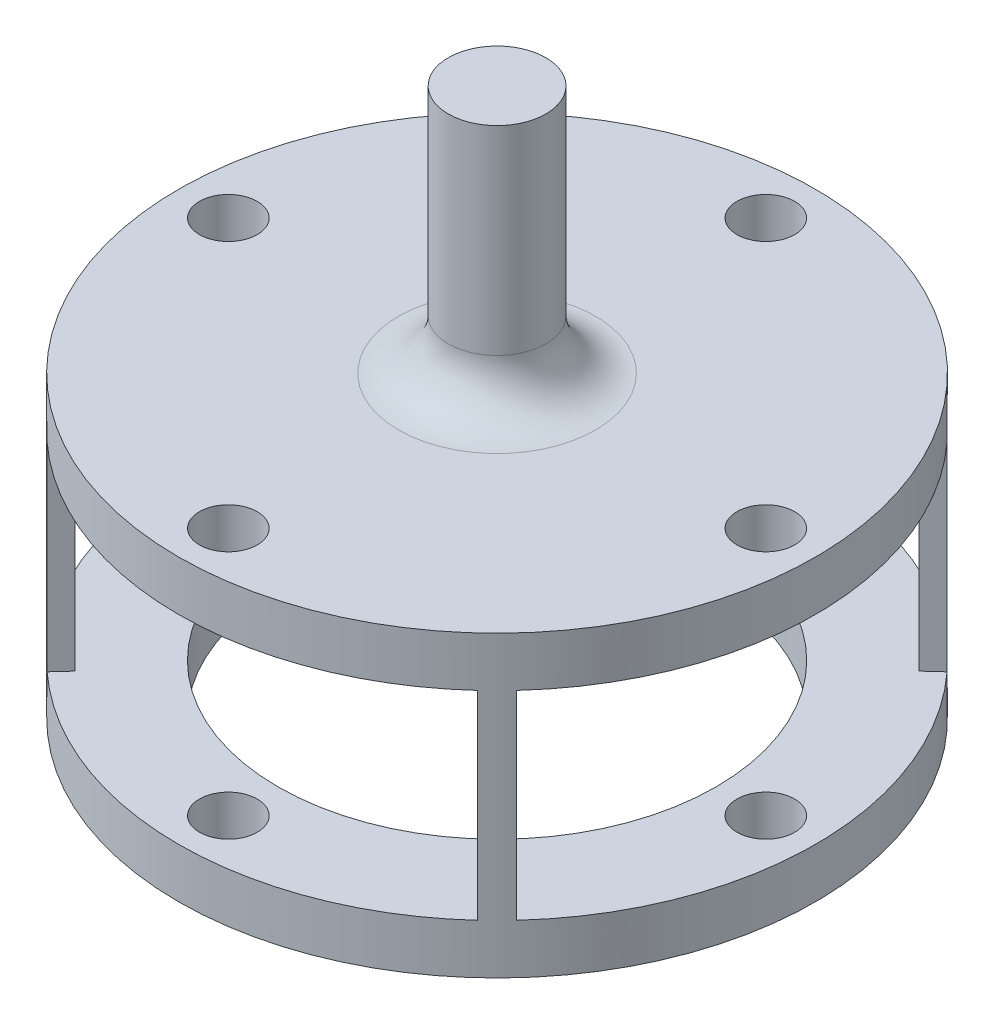
ISO-10303-21;
HEADER;
FILE_DESCRIPTION(('STEP AP214'),'2;1');
FILE_NAME('part.step','',(''),(''),'','','');
FILE_SCHEMA(('AUTOMOTIVE_DESIGN { 1 0 10303 214 1 1 1 1 }'));
ENDSEC;
DATA;
#1=APPLICATION_CONTEXT('core data for automotive mechanical design processes');
#2=APPLICATION_PROTOCOL_DEFINITION('international standard','automotive_design',2000,#1);
#3=PRODUCT_CONTEXT('',#1,'mechanical');
#4=PRODUCT('Part','Part','',(#3));
#5=PRODUCT_RELATED_PRODUCT_CATEGORY('part','',(#4));
#6=PRODUCT_DEFINITION_FORMATION('','',#4);
#7=PRODUCT_DEFINITION_CONTEXT('part definition',#1,'design');
#8=PRODUCT_DEFINITION('design','',#6,#7);
#9=PRODUCT_DEFINITION_SHAPE('','',#8);
#10=(LENGTH_UNIT() NAMED_UNIT(*) SI_UNIT(.MILLI.,.METRE.));
#11=(NAMED_UNIT(*) PLANE_ANGLE_UNIT() SI_UNIT($,.RADIAN.));
#12=(NAMED_UNIT(*) SI_UNIT($,.STERADIAN.) SOLID_ANGLE_UNIT());
#13=UNCERTAINTY_MEASURE_WITH_UNIT(LENGTH_MEASURE(1.E-05),#10,'distance_accuracy_value','');
#14=(GEOMETRIC_REPRESENTATION_CONTEXT(3) GLOBAL_UNCERTAINTY_ASSIGNED_CONTEXT((#13)) GLOBAL_UNIT_ASSIGNED_CONTEXT((#10,
#11,#12)) REPRESENTATION_CONTEXT('',''));
#15=CARTESIAN_POINT('',(0.,0.,0.));
#16=DIRECTION('',(0.,0.,1.));
#17=DIRECTION('',(1.,0.,0.));
#18=AXIS2_PLACEMENT_3D('',#15,#16,#17);
#19=CARTESIAN_POINT('',(0.,5.,0.));
#20=DIRECTION('',(0.,1.,0.));
#21=DIRECTION('',(0.,0.,1.));
#22=AXIS2_PLACEMENT_3D('',#19,#20,#21);
#23=PLANE('',#22);
#24=CARTESIAN_POINT('',(0.,5.,0.));
#25=DIRECTION('',(0.,1.,0.));
#26=DIRECTION('',(0.,0.,1.));
#27=AXIS2_PLACEMENT_3D('',#24,#25,#26);
#28=CIRCLE('',#27,22.);
#29=CARTESIAN_POINT('',(0.,5.,22.));
#30=VERTEX_POINT('',#29);
#31=EDGE_CURVE('E419',#30,#30,#28,.F.);
#32=ORIENTED_EDGE('',*,*,#31,.T.);
#33=EDGE_LOOP('',(#32));
#34=FACE_BOUND('',#33,.T.);
#35=CARTESIAN_POINT('',(27.,5.,0.));
#36=DIRECTION('',(0.,1.,0.));
#37=DIRECTION('',(0.,0.,1.));
#38=AXIS2_PLACEMENT_3D('',#35,#36,#37);
#39=CIRCLE('',#38,2.9);
#40=CARTESIAN_POINT('',(27.,5.,2.9));
#41=VERTEX_POINT('',#40);
#42=EDGE_CURVE('E374',#41,#41,#39,.F.);
#43=ORIENTED_EDGE('',*,*,#42,.T.);
#44=EDGE_LOOP('',(#43));
#45=FACE_BOUND('',#44,.T.);
#46=CARTESIAN_POINT('',(-1.88539992297529E-13,5.,27.));
#47=DIRECTION('',(0.,1.,0.));
#48=DIRECTION('',(0.,0.,1.));
#49=AXIS2_PLACEMENT_3D('',#46,#47,#48);
#50=CIRCLE('',#49,2.9);
#51=CARTESIAN_POINT('',(-1.88539992297529E-13,5.,29.9));
#52=VERTEX_POINT('',#51);
#53=EDGE_CURVE('E385',#52,#52,#50,.F.);
#54=ORIENTED_EDGE('',*,*,#53,.T.);
#55=EDGE_LOOP('',(#54));
#56=FACE_BOUND('',#55,.T.);
#57=CARTESIAN_POINT('',(0.,5.,-27.));
#58=DIRECTION('',(0.,1.,0.));
#59=DIRECTION('',(0.,0.,1.));
#60=AXIS2_PLACEMENT_3D('',#57,#58,#59);
#61=CIRCLE('',#60,2.9);
#62=CARTESIAN_POINT('',(0.,5.,-24.1));
#63=VERTEX_POINT('',#62);
#64=EDGE_CURVE('E393',#63,#63,#61,.F.);
#65=ORIENTED_EDGE('',*,*,#64,.T.);
#66=EDGE_LOOP('',(#65));
#67=FACE_BOUND('',#66,.T.);
#68=CARTESIAN_POINT('',(-27.,5.,-2.82809988446294E-13));
#69=DIRECTION('',(0.,1.,0.));
#70=DIRECTION('',(0.,0.,1.));
#71=AXIS2_PLACEMENT_3D('',#68,#69,#70);
#72=CIRCLE('',#71,2.9);
#73=CARTESIAN_POINT('',(-27.,5.,2.89999999999972));
#74=VERTEX_POINT('',#73);
#75=EDGE_CURVE('E401',#74,#74,#72,.F.);
#76=ORIENTED_EDGE('',*,*,#75,.T.);
#77=EDGE_LOOP('',(#76));
#78=FACE_BOUND('',#77,.T.);
#79=CARTESIAN_POINT('',(0.,5.,0.));
#80=DIRECTION('',(0.,1.,0.));
#81=DIRECTION('',(0.,0.,1.));
#82=AXIS2_PLACEMENT_3D('',#79,#80,#81);
#83=CIRCLE('',#82,32.);
#84=CARTESIAN_POINT('',(-21.6188866437012,5.,23.5928747779239));
#85=VERTEX_POINT('',#84);
#86=CARTESIAN_POINT('',(21.6188866437013,5.,23.5928747779238));
#87=VERTEX_POINT('',#86);
#88=EDGE_CURVE('E252',#85,#87,#83,.T.);
#89=ORIENTED_EDGE('',*,*,#88,.T.);
#90=DIRECTION('',(-0.675590207615662,0.,-0.737277336810122));
#91=VECTOR('',#90,1.);
#92=CARTESIAN_POINT('',(21.6188866437013,5.,23.5928747779239));
#93=LINE('',#92,#91);
#94=CARTESIAN_POINT('',(20.2677062284699,5.,22.1183201043036));
#95=VERTEX_POINT('',#94);
#96=EDGE_CURVE('E69',#87,#95,#93,.T.);
#97=ORIENTED_EDGE('',*,*,#96,.T.);
#98=CARTESIAN_POINT('',(0.,5.,0.));
#99=DIRECTION('',(0.,-1.,0.));
#100=DIRECTION('',(0.,0.,-1.));
#101=AXIS2_PLACEMENT_3D('',#98,#99,#100);
#102=CIRCLE('',#101,30.);
#103=CARTESIAN_POINT('',(22.1183201043037,5.,20.2677062284698));
#104=VERTEX_POINT('',#103);
#105=EDGE_CURVE('E300',#104,#95,#102,.T.);
#106=ORIENTED_EDGE('',*,*,#105,.F.);
#107=DIRECTION('',(-0.737277336810122,0.,-0.675590207615662));
#108=VECTOR('',#107,1.);
#109=CARTESIAN_POINT('',(23.592874777924,5.,21.6188866437012));
#110=LINE('',#109,#108);
#111=CARTESIAN_POINT('',(23.5928747779239,5.,21.6188866437012));
#112=VERTEX_POINT('',#111);
#113=EDGE_CURVE('E212',#112,#104,#110,.T.);
#114=ORIENTED_EDGE('',*,*,#113,.F.);
#115=CARTESIAN_POINT('',(23.5928747779238,5.,-21.6188866437013));
#116=VERTEX_POINT('',#115);
#117=EDGE_CURVE('E186',#112,#116,#83,.T.);
#118=ORIENTED_EDGE('',*,*,#117,.T.);
#119=DIRECTION('',(-0.737277336810122,0.,0.675590207615663));
#120=VECTOR('',#119,1.);
#121=CARTESIAN_POINT('',(23.5928747779238,5.,-21.6188866437013));
#122=LINE('',#121,#120);
#123=CARTESIAN_POINT('',(22.1183201043035,5.,-20.26770622847));
#124=VERTEX_POINT('',#123);
#125=EDGE_CURVE('E76',#116,#124,#122,.T.);
#126=ORIENTED_EDGE('',*,*,#125,.T.);
#127=CARTESIAN_POINT('',(0.,5.,0.));
#128=DIRECTION('',(0.,-1.,0.));
#129=DIRECTION('',(0.,0.,-1.));
#130=AXIS2_PLACEMENT_3D('',#127,#128,#129);
#131=CIRCLE('',#130,30.);
#132=CARTESIAN_POINT('',(20.2677062284697,5.,-22.1183201043038));
#133=VERTEX_POINT('',#132);
#134=EDGE_CURVE('E327',#133,#124,#131,.T.);
#135=ORIENTED_EDGE('',*,*,#134,.F.);
#136=DIRECTION('',(-0.675590207615661,0.,0.737277336810123));
#137=VECTOR('',#136,1.);
#138=CARTESIAN_POINT('',(21.6188866437011,5.,-23.592874777924));
#139=LINE('',#138,#137);
#140=CARTESIAN_POINT('',(21.6188866437011,5.,-23.592874777924));
#141=VERTEX_POINT('',#140);
#142=EDGE_CURVE('E316',#141,#133,#139,.T.);
#143=ORIENTED_EDGE('',*,*,#142,.F.);
#144=CARTESIAN_POINT('',(-21.6188866437014,5.,-23.5928747779237));
#145=VERTEX_POINT('',#144);
#146=EDGE_CURVE('E263',#141,#145,#83,.T.);
#147=ORIENTED_EDGE('',*,*,#146,.T.);
#148=DIRECTION('',(0.675590207615667,0.,0.737277336810118));
#149=VECTOR('',#148,1.);
#150=CARTESIAN_POINT('',(-21.6188866437014,5.,-23.5928747779237));
#151=LINE('',#150,#149);
#152=CARTESIAN_POINT('',(-20.2677062284701,5.,-22.1183201043035));
#153=VERTEX_POINT('',#152);
#154=EDGE_CURVE('E229',#145,#153,#151,.T.);
#155=ORIENTED_EDGE('',*,*,#154,.T.);
#156=CARTESIAN_POINT('',(0.,5.,0.));
#157=DIRECTION('',(0.,-1.,0.));
#158=DIRECTION('',(0.,0.,-1.));
#159=AXIS2_PLACEMENT_3D('',#156,#157,#158);
#160=CIRCLE('',#159,30.);
#161=CARTESIAN_POINT('',(-22.1183201043038,5.,-20.2677062284697));
#162=VERTEX_POINT('',#161);
#163=EDGE_CURVE('E355',#162,#153,#160,.T.);
#164=ORIENTED_EDGE('',*,*,#163,.F.);
#165=DIRECTION('',(0.737277336810126,0.,0.675590207615658));
#166=VECTOR('',#165,1.);
#167=CARTESIAN_POINT('',(-23.5928747779241,5.,-21.618886643701));
#168=LINE('',#167,#166);
#169=CARTESIAN_POINT('',(-23.5928747779241,5.,-21.618886643701));
#170=VERTEX_POINT('',#169);
#171=EDGE_CURVE('E271',#170,#162,#168,.T.);
#172=ORIENTED_EDGE('',*,*,#171,.F.);
#173=CARTESIAN_POINT('',(-23.5928747779239,5.,21.6188866437012));
#174=VERTEX_POINT('',#173);
#175=EDGE_CURVE('E255',#170,#174,#83,.T.);
#176=ORIENTED_EDGE('',*,*,#175,.T.);
#177=DIRECTION('',(0.737277336810125,0.,-0.67559020761566));
#178=VECTOR('',#177,1.);
#179=CARTESIAN_POINT('',(-23.5928747779239,5.,21.6188866437012));
#180=LINE('',#179,#178);
#181=CARTESIAN_POINT('',(-22.1183201043037,5.,20.2677062284699));
#182=VERTEX_POINT('',#181);
#183=EDGE_CURVE('E225',#174,#182,#180,.T.);
#184=ORIENTED_EDGE('',*,*,#183,.T.);
#185=CARTESIAN_POINT('',(0.,5.,0.));
#186=DIRECTION('',(0.,-1.,0.));
#187=DIRECTION('',(0.,0.,-1.));
#188=AXIS2_PLACEMENT_3D('',#185,#186,#187);
#189=CIRCLE('',#188,30.);
#190=CARTESIAN_POINT('',(-20.2677062284699,5.,22.1183201043036));
#191=VERTEX_POINT('',#190);
#192=EDGE_CURVE('E228',#191,#182,#189,.T.);
#193=ORIENTED_EDGE('',*,*,#192,.F.);
#194=DIRECTION('',(0.675590207615665,0.,-0.73727733681012));
#195=VECTOR('',#194,1.);
#196=CARTESIAN_POINT('',(-21.6188866437012,5.,23.5928747779239));
#197=LINE('',#196,#195);
#198=EDGE_CURVE('E218',#85,#191,#197,.T.);
#199=ORIENTED_EDGE('',*,*,#198,.F.);
#200=EDGE_LOOP('',(#89,#97,#106,#114,#118,#126,#135,#143,#147,#155,#164,#172,#176,#184,#193,#199));
#201=FACE_BOUND('',#200,.T.);
#202=ADVANCED_FACE('F53',(#34,#45,#56,#67,#78,#201),#23,.T.);
#203=CARTESIAN_POINT('',(0.,5.,0.));
#204=DIRECTION('',(0.,-1.,0.));
#205=DIRECTION('',(0.,0.,-1.));
#206=AXIS2_PLACEMENT_3D('',#203,#204,#205);
#207=CYLINDRICAL_SURFACE('',#206,32.);
#208=CARTESIAN_POINT('',(0.,25.,0.));
#209=DIRECTION('',(0.,1.,0.));
#210=DIRECTION('',(0.,0.,1.));
#211=AXIS2_PLACEMENT_3D('',#208,#209,#210);
#212=CIRCLE('',#211,32.);
#213=CARTESIAN_POINT('',(-23.5928747779241,25.,-21.618886643701));
#214=VERTEX_POINT('',#213);
#215=CARTESIAN_POINT('',(-23.5928747779239,25.,21.6188866437012));
#216=VERTEX_POINT('',#215);
#217=EDGE_CURVE('E277',#214,#216,#212,.T.);
#218=ORIENTED_EDGE('',*,*,#217,.T.);
#219=DIRECTION('',(0.,-1.,0.));
#220=VECTOR('',#219,1.);
#221=CARTESIAN_POINT('',(-23.5928747779239,25.,21.6188866437012));
#222=LINE('',#221,#220);
#223=EDGE_CURVE('E224',#216,#174,#222,.T.);
#224=ORIENTED_EDGE('',*,*,#223,.T.);
#225=ORIENTED_EDGE('',*,*,#175,.F.);
#226=DIRECTION('',(0.,-1.,0.));
#227=VECTOR('',#226,1.);
#228=CARTESIAN_POINT('',(-23.5928747779241,25.,-21.618886643701));
#229=LINE('',#228,#227);
#230=EDGE_CURVE('E326',#214,#170,#229,.T.);
#231=ORIENTED_EDGE('',*,*,#230,.F.);
#232=EDGE_LOOP('',(#218,#224,#225,#231));
#233=FACE_BOUND('',#232,.T.);
#234=CARTESIAN_POINT('',(21.6188866437011,25.,-23.592874777924));
#235=VERTEX_POINT('',#234);
#236=CARTESIAN_POINT('',(-21.6188866437014,25.,-23.5928747779237));
#237=VERTEX_POINT('',#236);
#238=EDGE_CURVE('E178',#235,#237,#212,.T.);
#239=ORIENTED_EDGE('',*,*,#238,.T.);
#240=DIRECTION('',(0.,-1.,0.));
#241=VECTOR('',#240,1.);
#242=CARTESIAN_POINT('',(-21.6188866437014,25.,-23.5928747779237));
#243=LINE('',#242,#241);
#244=EDGE_CURVE('E352',#237,#145,#243,.T.);
#245=ORIENTED_EDGE('',*,*,#244,.T.);
#246=ORIENTED_EDGE('',*,*,#146,.F.);
#247=DIRECTION('',(0.,-1.,0.));
#248=VECTOR('',#247,1.);
#249=CARTESIAN_POINT('',(21.6188866437011,25.,-23.592874777924));
#250=LINE('',#249,#248);
#251=EDGE_CURVE('E299',#235,#141,#250,.T.);
#252=ORIENTED_EDGE('',*,*,#251,.F.);
#253=EDGE_LOOP('',(#239,#245,#246,#252));
#254=FACE_BOUND('',#253,.T.);
#255=CARTESIAN_POINT('',(23.5928747779239,25.,21.6188866437012));
#256=VERTEX_POINT('',#255);
#257=CARTESIAN_POINT('',(23.5928747779238,25.,-21.6188866437013));
#258=VERTEX_POINT('',#257);
#259=EDGE_CURVE('E165',#256,#258,#212,.T.);
#260=ORIENTED_EDGE('',*,*,#259,.T.);
#261=DIRECTION('',(0.,-1.,0.));
#262=VECTOR('',#261,1.);
#263=CARTESIAN_POINT('',(23.5928747779238,25.,-21.6188866437013));
#264=LINE('',#263,#262);
#265=EDGE_CURVE('E323',#258,#116,#264,.T.);
#266=ORIENTED_EDGE('',*,*,#265,.T.);
#267=ORIENTED_EDGE('',*,*,#117,.F.);
#268=DIRECTION('',(0.,-1.,0.));
#269=VECTOR('',#268,1.);
#270=CARTESIAN_POINT('',(23.592874777924,25.,21.6188866437012));
#271=LINE('',#270,#269);
#272=EDGE_CURVE('E183',#256,#112,#271,.T.);
#273=ORIENTED_EDGE('',*,*,#272,.F.);
#274=EDGE_LOOP('',(#260,#266,#267,#273));
#275=FACE_BOUND('',#274,.T.);
#276=DIRECTION('',(0.,-1.,0.));
#277=VECTOR('',#276,1.);
#278=CARTESIAN_POINT('',(-21.6188866437012,25.,23.5928747779239));
#279=LINE('',#278,#277);
#280=CARTESIAN_POINT('',(-21.6188866437012,25.,23.5928747779239));
#281=VERTEX_POINT('',#280);
#282=EDGE_CURVE('E236',#281,#85,#279,.T.);
#283=ORIENTED_EDGE('',*,*,#282,.F.);
#284=CARTESIAN_POINT('',(21.6188866437013,25.,23.5928747779239));
#285=VERTEX_POINT('',#284);
#286=EDGE_CURVE('E180',#281,#285,#212,.T.);
#287=ORIENTED_EDGE('',*,*,#286,.T.);
#288=DIRECTION('',(0.,-1.,0.));
#289=VECTOR('',#288,1.);
#290=CARTESIAN_POINT('',(21.6188866437013,25.,23.5928747779239));
#291=LINE('',#290,#289);
#292=EDGE_CURVE('E197',#285,#87,#291,.T.);
#293=ORIENTED_EDGE('',*,*,#292,.T.);
#294=ORIENTED_EDGE('',*,*,#88,.F.);
#295=EDGE_LOOP('',(#283,#287,#293,#294));
#296=FACE_BOUND('',#295,.T.);
#297=CARTESIAN_POINT('',(0.,0.,0.));
#298=DIRECTION('',(0.,1.,0.));
#299=DIRECTION('',(0.,0.,1.));
#300=AXIS2_PLACEMENT_3D('',#297,#298,#299);
#301=CIRCLE('',#300,32.);
#302=CARTESIAN_POINT('',(0.,0.,32.));
#303=VERTEX_POINT('',#302);
#304=EDGE_CURVE('E240',#303,#303,#301,.T.);
#305=ORIENTED_EDGE('',*,*,#304,.T.);
#306=EDGE_LOOP('',(#305));
#307=FACE_BOUND('',#306,.T.);
#308=CARTESIAN_POINT('',(0.,30.,0.));
#309=DIRECTION('',(0.,1.,0.));
#310=DIRECTION('',(0.,0.,1.));
#311=AXIS2_PLACEMENT_3D('',#308,#309,#310);
#312=CIRCLE('',#311,32.);
#313=CARTESIAN_POINT('',(0.,30.,32.));
#314=VERTEX_POINT('',#313);
#315=EDGE_CURVE('E177',#314,#314,#312,.T.);
#316=ORIENTED_EDGE('',*,*,#315,.F.);
#317=EDGE_LOOP('',(#316));
#318=FACE_BOUND('',#317,.T.);
#319=ADVANCED_FACE('F184',(#233,#254,#275,#296,#307,#318),#207,.T.);
#320=CARTESIAN_POINT('',(0.,0.,0.));
#321=DIRECTION('',(0.,1.,0.));
#322=DIRECTION('',(0.,0.,1.));
#323=AXIS2_PLACEMENT_3D('',#320,#321,#322);
#324=PLANE('',#323);
#325=CARTESIAN_POINT('',(0.,0.,0.));
#326=DIRECTION('',(0.,1.,0.));
#327=DIRECTION('',(0.,0.,1.));
#328=AXIS2_PLACEMENT_3D('',#325,#326,#327);
#329=CIRCLE('',#328,22.);
#330=CARTESIAN_POINT('',(0.,0.,22.));
#331=VERTEX_POINT('',#330);
#332=EDGE_CURVE('E445',#331,#331,#329,.T.);
#333=ORIENTED_EDGE('',*,*,#332,.T.);
#334=EDGE_LOOP('',(#333));
#335=FACE_BOUND('',#334,.T.);
#336=CARTESIAN_POINT('',(27.,0.,0.));
#337=DIRECTION('',(0.,1.,0.));
#338=DIRECTION('',(0.,0.,1.));
#339=AXIS2_PLACEMENT_3D('',#336,#337,#338);
#340=CIRCLE('',#339,2.9);
#341=CARTESIAN_POINT('',(27.,0.,2.9));
#342=VERTEX_POINT('',#341);
#343=EDGE_CURVE('E432',#342,#342,#340,.T.);
#344=ORIENTED_EDGE('',*,*,#343,.T.);
#345=EDGE_LOOP('',(#344));
#346=FACE_BOUND('',#345,.T.);
#347=CARTESIAN_POINT('',(-1.88539992297529E-13,0.,27.));
#348=DIRECTION('',(0.,1.,0.));
#349=DIRECTION('',(0.,0.,1.));
#350=AXIS2_PLACEMENT_3D('',#347,#348,#349);
#351=CIRCLE('',#350,2.9);
#352=CARTESIAN_POINT('',(-1.88539992297529E-13,0.,29.9));
#353=VERTEX_POINT('',#352);
#354=EDGE_CURVE('E428',#353,#353,#351,.T.);
#355=ORIENTED_EDGE('',*,*,#354,.T.);
#356=EDGE_LOOP('',(#355));
#357=FACE_BOUND('',#356,.T.);
#358=CARTESIAN_POINT('',(0.,0.,-27.));
#359=DIRECTION('',(0.,1.,0.));
#360=DIRECTION('',(0.,0.,1.));
#361=AXIS2_PLACEMENT_3D('',#358,#359,#360);
#362=CIRCLE('',#361,2.9);
#363=CARTESIAN_POINT('',(0.,0.,-24.1));
#364=VERTEX_POINT('',#363);
#365=EDGE_CURVE('E420',#364,#364,#362,.T.);
#366=ORIENTED_EDGE('',*,*,#365,.T.);
#367=EDGE_LOOP('',(#366));
#368=FACE_BOUND('',#367,.T.);
#369=CARTESIAN_POINT('',(-27.,0.,-2.82809988446294E-13));
#370=DIRECTION('',(0.,1.,0.));
#371=DIRECTION('',(0.,0.,1.));
#372=AXIS2_PLACEMENT_3D('',#369,#370,#371);
#373=CIRCLE('',#372,2.9);
#374=CARTESIAN_POINT('',(-27.,0.,2.89999999999972));
#375=VERTEX_POINT('',#374);
#376=EDGE_CURVE('E410',#375,#375,#373,.T.);
#377=ORIENTED_EDGE('',*,*,#376,.T.);
#378=EDGE_LOOP('',(#377));
#379=FACE_BOUND('',#378,.T.);
#380=ORIENTED_EDGE('',*,*,#304,.F.);
#381=EDGE_LOOP('',(#380));
#382=FACE_BOUND('',#381,.T.);
#383=ADVANCED_FACE('F478',(#335,#346,#357,#368,#379,#382),#324,.F.);
#384=CARTESIAN_POINT('',(-21.6188866437012,25.,23.5928747779239));
#385=DIRECTION('',(-0.73727733681012,0.,-0.675590207615665));
#386=DIRECTION('',(-0.675590207615665,0.,0.73727733681012));
#387=AXIS2_PLACEMENT_3D('',#384,#385,#386);
#388=PLANE('',#387);
#389=ORIENTED_EDGE('',*,*,#198,.T.);
#390=DIRECTION('',(0.,-1.,0.));
#391=VECTOR('',#390,1.);
#392=CARTESIAN_POINT('',(-20.2677062284699,25.,22.1183201043036));
#393=LINE('',#392,#391);
#394=CARTESIAN_POINT('',(-20.2677062284699,25.,22.1183201043036));
#395=VERTEX_POINT('',#394);
#396=EDGE_CURVE('E241',#395,#191,#393,.T.);
#397=ORIENTED_EDGE('',*,*,#396,.F.);
#398=DIRECTION('',(0.675590207615665,0.,-0.73727733681012));
#399=VECTOR('',#398,1.);
#400=CARTESIAN_POINT('',(-21.6188866437012,25.,23.5928747779239));
#401=LINE('',#400,#399);
#402=EDGE_CURVE('E221',#281,#395,#401,.T.);
#403=ORIENTED_EDGE('',*,*,#402,.F.);
#404=ORIENTED_EDGE('',*,*,#282,.T.);
#405=EDGE_LOOP('',(#389,#397,#403,#404));
#406=FACE_BOUND('',#405,.T.);
#407=ADVANCED_FACE('F288',(#406),#388,.F.);
#408=CARTESIAN_POINT('',(0.,25.,0.));
#409=DIRECTION('',(0.,-1.,0.));
#410=DIRECTION('',(0.,0.,-1.));
#411=AXIS2_PLACEMENT_3D('',#408,#409,#410);
#412=CYLINDRICAL_SURFACE('',#411,30.);
#413=ORIENTED_EDGE('',*,*,#192,.T.);
#414=DIRECTION('',(0.,-1.,0.));
#415=VECTOR('',#414,1.);
#416=CARTESIAN_POINT('',(-22.1183201043037,25.,20.2677062284699));
#417=LINE('',#416,#415);
#418=CARTESIAN_POINT('',(-22.1183201043037,25.,20.2677062284699));
#419=VERTEX_POINT('',#418);
#420=EDGE_CURVE('E245',#419,#182,#417,.T.);
#421=ORIENTED_EDGE('',*,*,#420,.F.);
#422=CARTESIAN_POINT('',(0.,25.,0.));
#423=DIRECTION('',(0.,-1.,0.));
#424=DIRECTION('',(0.,0.,-1.));
#425=AXIS2_PLACEMENT_3D('',#422,#423,#424);
#426=CIRCLE('',#425,30.);
#427=EDGE_CURVE('E217',#395,#419,#426,.T.);
#428=ORIENTED_EDGE('',*,*,#427,.F.);
#429=ORIENTED_EDGE('',*,*,#396,.T.);
#430=EDGE_LOOP('',(#413,#421,#428,#429));
#431=FACE_BOUND('',#430,.T.);
#432=ADVANCED_FACE('F284',(#431),#412,.F.);
#433=CARTESIAN_POINT('',(-23.5928747779239,25.,21.6188866437012));
#434=DIRECTION('',(-0.67559020761566,0.,-0.737277336810125));
#435=DIRECTION('',(-0.737277336810125,0.,0.67559020761566));
#436=AXIS2_PLACEMENT_3D('',#433,#434,#435);
#437=PLANE('',#436);
#438=ORIENTED_EDGE('',*,*,#183,.F.);
#439=ORIENTED_EDGE('',*,*,#223,.F.);
#440=DIRECTION('',(0.737277336810125,0.,-0.67559020761566));
#441=VECTOR('',#440,1.);
#442=CARTESIAN_POINT('',(-23.5928747779239,25.,21.6188866437012));
#443=LINE('',#442,#441);
#444=EDGE_CURVE('E213',#216,#419,#443,.T.);
#445=ORIENTED_EDGE('',*,*,#444,.T.);
#446=ORIENTED_EDGE('',*,*,#420,.T.);
#447=EDGE_LOOP('',(#438,#439,#445,#446));
#448=FACE_BOUND('',#447,.T.);
#449=ADVANCED_FACE('F280',(#448),#437,.T.);
#450=CARTESIAN_POINT('',(-23.5928747779241,25.,-21.618886643701));
#451=DIRECTION('',(0.675590207615658,0.,-0.737277336810126));
#452=DIRECTION('',(-0.737277336810126,0.,-0.675590207615658));
#453=AXIS2_PLACEMENT_3D('',#450,#451,#452);
#454=PLANE('',#453);
#455=ORIENTED_EDGE('',*,*,#171,.T.);
#456=DIRECTION('',(0.,-1.,0.));
#457=VECTOR('',#456,1.);
#458=CARTESIAN_POINT('',(-22.1183201043038,25.,-20.2677062284697));
#459=LINE('',#458,#457);
#460=CARTESIAN_POINT('',(-22.1183201043038,25.,-20.2677062284697));
#461=VERTEX_POINT('',#460);
#462=EDGE_CURVE('E363',#461,#162,#459,.T.);
#463=ORIENTED_EDGE('',*,*,#462,.F.);
#464=DIRECTION('',(0.737277336810126,0.,0.675590207615658));
#465=VECTOR('',#464,1.);
#466=CARTESIAN_POINT('',(-23.5928747779241,25.,-21.618886643701));
#467=LINE('',#466,#465);
#468=EDGE_CURVE('E349',#214,#461,#467,.T.);
#469=ORIENTED_EDGE('',*,*,#468,.F.);
#470=ORIENTED_EDGE('',*,*,#230,.T.);
#471=EDGE_LOOP('',(#455,#463,#469,#470));
#472=FACE_BOUND('',#471,.T.);
#473=ADVANCED_FACE('F527',(#472),#454,.F.);
#474=CARTESIAN_POINT('',(0.,25.,0.));
#475=DIRECTION('',(0.,-1.,0.));
#476=DIRECTION('',(0.,0.,-1.));
#477=AXIS2_PLACEMENT_3D('',#474,#475,#476);
#478=CYLINDRICAL_SURFACE('',#477,30.);
#479=ORIENTED_EDGE('',*,*,#163,.T.);
#480=DIRECTION('',(0.,-1.,0.));
#481=VECTOR('',#480,1.);
#482=CARTESIAN_POINT('',(-20.2677062284701,25.,-22.1183201043035));
#483=LINE('',#482,#481);
#484=CARTESIAN_POINT('',(-20.2677062284701,25.,-22.1183201043035));
#485=VERTEX_POINT('',#484);
#486=EDGE_CURVE('E367',#485,#153,#483,.T.);
#487=ORIENTED_EDGE('',*,*,#486,.F.);
#488=CARTESIAN_POINT('',(0.,25.,0.));
#489=DIRECTION('',(0.,-1.,0.));
#490=DIRECTION('',(0.,0.,-1.));
#491=AXIS2_PLACEMENT_3D('',#488,#489,#490);
#492=CIRCLE('',#491,30.);
#493=EDGE_CURVE('E346',#461,#485,#492,.T.);
#494=ORIENTED_EDGE('',*,*,#493,.F.);
#495=ORIENTED_EDGE('',*,*,#462,.T.);
#496=EDGE_LOOP('',(#479,#487,#494,#495));
#497=FACE_BOUND('',#496,.T.);
#498=ADVANCED_FACE('F523',(#497),#478,.F.);
#499=CARTESIAN_POINT('',(-21.6188866437014,25.,-23.5928747779237));
#500=DIRECTION('',(0.737277336810118,0.,-0.675590207615667));
#501=DIRECTION('',(-0.675590207615667,0.,-0.737277336810118));
#502=AXIS2_PLACEMENT_3D('',#499,#500,#501);
#503=PLANE('',#502);
#504=ORIENTED_EDGE('',*,*,#154,.F.);
#505=ORIENTED_EDGE('',*,*,#244,.F.);
#506=DIRECTION('',(0.675590207615667,0.,0.737277336810118));
#507=VECTOR('',#506,1.);
#508=CARTESIAN_POINT('',(-21.6188866437014,25.,-23.5928747779237));
#509=LINE('',#508,#507);
#510=EDGE_CURVE('E342',#237,#485,#509,.T.);
#511=ORIENTED_EDGE('',*,*,#510,.T.);
#512=ORIENTED_EDGE('',*,*,#486,.T.);
#513=EDGE_LOOP('',(#504,#505,#511,#512));
#514=FACE_BOUND('',#513,.T.);
#515=ADVANCED_FACE('F519',(#514),#503,.T.);
#516=CARTESIAN_POINT('',(21.6188866437011,25.,-23.592874777924));
#517=DIRECTION('',(0.737277336810123,0.,0.675590207615661));
#518=DIRECTION('',(0.675590207615661,0.,-0.737277336810123));
#519=AXIS2_PLACEMENT_3D('',#516,#517,#518);
#520=PLANE('',#519);
#521=ORIENTED_EDGE('',*,*,#142,.T.);
#522=DIRECTION('',(0.,-1.,0.));
#523=VECTOR('',#522,1.);
#524=CARTESIAN_POINT('',(20.2677062284697,25.,-22.1183201043038));
#525=LINE('',#524,#523);
#526=CARTESIAN_POINT('',(20.2677062284697,25.,-22.1183201043038));
#527=VERTEX_POINT('',#526);
#528=EDGE_CURVE('E304',#527,#133,#525,.T.);
#529=ORIENTED_EDGE('',*,*,#528,.F.);
#530=DIRECTION('',(-0.675590207615661,0.,0.737277336810123));
#531=VECTOR('',#530,1.);
#532=CARTESIAN_POINT('',(21.6188866437011,25.,-23.592874777924));
#533=LINE('',#532,#531);
#534=EDGE_CURVE('E320',#235,#527,#533,.T.);
#535=ORIENTED_EDGE('',*,*,#534,.F.);
#536=ORIENTED_EDGE('',*,*,#251,.T.);
#537=EDGE_LOOP('',(#521,#529,#535,#536));
#538=FACE_BOUND('',#537,.T.);
#539=ADVANCED_FACE('F522',(#538),#520,.F.);
#540=CARTESIAN_POINT('',(0.,25.,0.));
#541=DIRECTION('',(0.,-1.,0.));
#542=DIRECTION('',(0.,0.,-1.));
#543=AXIS2_PLACEMENT_3D('',#540,#541,#542);
#544=CYLINDRICAL_SURFACE('',#543,30.);
#545=ORIENTED_EDGE('',*,*,#134,.T.);
#546=DIRECTION('',(0.,-1.,0.));
#547=VECTOR('',#546,1.);
#548=CARTESIAN_POINT('',(22.1183201043035,25.,-20.26770622847));
#549=LINE('',#548,#547);
#550=CARTESIAN_POINT('',(22.1183201043035,25.,-20.26770622847));
#551=VERTEX_POINT('',#550);
#552=EDGE_CURVE('E337',#551,#124,#549,.T.);
#553=ORIENTED_EDGE('',*,*,#552,.F.);
#554=CARTESIAN_POINT('',(0.,25.,0.));
#555=DIRECTION('',(0.,-1.,0.));
#556=DIRECTION('',(0.,0.,-1.));
#557=AXIS2_PLACEMENT_3D('',#554,#555,#556);
#558=CIRCLE('',#557,30.);
#559=EDGE_CURVE('E317',#527,#551,#558,.T.);
#560=ORIENTED_EDGE('',*,*,#559,.F.);
#561=ORIENTED_EDGE('',*,*,#528,.T.);
#562=EDGE_LOOP('',(#545,#553,#560,#561));
#563=FACE_BOUND('',#562,.T.);
#564=ADVANCED_FACE('F535',(#563),#544,.F.);
#565=CARTESIAN_POINT('',(23.5928747779238,25.,-21.6188866437013));
#566=DIRECTION('',(0.675590207615663,0.,0.737277336810122));
#567=DIRECTION('',(0.737277336810122,0.,-0.675590207615663));
#568=AXIS2_PLACEMENT_3D('',#565,#566,#567);
#569=PLANE('',#568);
#570=ORIENTED_EDGE('',*,*,#125,.F.);
#571=ORIENTED_EDGE('',*,*,#265,.F.);
#572=DIRECTION('',(-0.737277336810122,0.,0.675590207615663));
#573=VECTOR('',#572,1.);
#574=CARTESIAN_POINT('',(23.5928747779238,25.,-21.6188866437013));
#575=LINE('',#574,#573);
#576=EDGE_CURVE('E172',#258,#551,#575,.T.);
#577=ORIENTED_EDGE('',*,*,#576,.T.);
#578=ORIENTED_EDGE('',*,*,#552,.T.);
#579=EDGE_LOOP('',(#570,#571,#577,#578));
#580=FACE_BOUND('',#579,.T.);
#581=ADVANCED_FACE('F532',(#580),#569,.T.);
#582=CARTESIAN_POINT('',(23.592874777924,25.,21.6188866437012));
#583=DIRECTION('',(-0.675590207615662,0.,0.737277336810122));
#584=DIRECTION('',(0.737277336810122,0.,0.675590207615662));
#585=AXIS2_PLACEMENT_3D('',#582,#583,#584);
#586=PLANE('',#585);
#587=ORIENTED_EDGE('',*,*,#113,.T.);
#588=DIRECTION('',(0.,-1.,0.));
#589=VECTOR('',#588,1.);
#590=CARTESIAN_POINT('',(22.1183201043037,25.,20.2677062284698));
#591=LINE('',#590,#589);
#592=CARTESIAN_POINT('',(22.1183201043037,25.,20.2677062284698));
#593=VERTEX_POINT('',#592);
#594=EDGE_CURVE('E190',#593,#104,#591,.T.);
#595=ORIENTED_EDGE('',*,*,#594,.F.);
#596=DIRECTION('',(-0.737277336810122,0.,-0.675590207615662));
#597=VECTOR('',#596,1.);
#598=CARTESIAN_POINT('',(23.592874777924,25.,21.6188866437012));
#599=LINE('',#598,#597);
#600=EDGE_CURVE('E169',#256,#593,#599,.T.);
#601=ORIENTED_EDGE('',*,*,#600,.F.);
#602=ORIENTED_EDGE('',*,*,#272,.T.);
#603=EDGE_LOOP('',(#587,#595,#601,#602));
#604=FACE_BOUND('',#603,.T.);
#605=ADVANCED_FACE('F192',(#604),#586,.F.);
#606=CARTESIAN_POINT('',(0.,25.,0.));
#607=DIRECTION('',(0.,-1.,0.));
#608=DIRECTION('',(0.,0.,-1.));
#609=AXIS2_PLACEMENT_3D('',#606,#607,#608);
#610=CYLINDRICAL_SURFACE('',#609,30.);
#611=ORIENTED_EDGE('',*,*,#105,.T.);
#612=DIRECTION('',(0.,-1.,0.));
#613=VECTOR('',#612,1.);
#614=CARTESIAN_POINT('',(20.2677062284699,25.,22.1183201043036));
#615=LINE('',#614,#613);
#616=CARTESIAN_POINT('',(20.2677062284699,25.,22.1183201043036));
#617=VERTEX_POINT('',#616);
#618=EDGE_CURVE('E204',#617,#95,#615,.T.);
#619=ORIENTED_EDGE('',*,*,#618,.F.);
#620=CARTESIAN_POINT('',(0.,25.,0.));
#621=DIRECTION('',(0.,-1.,0.));
#622=DIRECTION('',(0.,0.,-1.));
#623=AXIS2_PLACEMENT_3D('',#620,#621,#622);
#624=CIRCLE('',#623,30.);
#625=EDGE_CURVE('E196',#593,#617,#624,.T.);
#626=ORIENTED_EDGE('',*,*,#625,.F.);
#627=ORIENTED_EDGE('',*,*,#594,.T.);
#628=EDGE_LOOP('',(#611,#619,#626,#627));
#629=FACE_BOUND('',#628,.T.);
#630=ADVANCED_FACE('F545',(#629),#610,.F.);
#631=CARTESIAN_POINT('',(21.6188866437013,25.,23.5928747779239));
#632=DIRECTION('',(-0.737277336810122,0.,0.675590207615662));
#633=DIRECTION('',(0.675590207615662,0.,0.737277336810122));
#634=AXIS2_PLACEMENT_3D('',#631,#632,#633);
#635=PLANE('',#634);
#636=ORIENTED_EDGE('',*,*,#96,.F.);
#637=ORIENTED_EDGE('',*,*,#292,.F.);
#638=DIRECTION('',(-0.675590207615662,0.,-0.737277336810122));
#639=VECTOR('',#638,1.);
#640=CARTESIAN_POINT('',(21.6188866437013,25.,23.5928747779239));
#641=LINE('',#640,#639);
#642=EDGE_CURVE('E201',#285,#617,#641,.T.);
#643=ORIENTED_EDGE('',*,*,#642,.T.);
#644=ORIENTED_EDGE('',*,*,#618,.T.);
#645=EDGE_LOOP('',(#636,#637,#643,#644));
#646=FACE_BOUND('',#645,.T.);
#647=ADVANCED_FACE('F295',(#646),#635,.T.);
#648=CARTESIAN_POINT('',(0.,25.,0.));
#649=DIRECTION('',(0.,1.,0.));
#650=DIRECTION('',(0.,0.,1.));
#651=AXIS2_PLACEMENT_3D('',#648,#649,#650);
#652=PLANE('',#651);
#653=CARTESIAN_POINT('',(27.,25.,0.));
#654=DIRECTION('',(0.,1.,0.));
#655=DIRECTION('',(0.,0.,1.));
#656=AXIS2_PLACEMENT_3D('',#653,#654,#655);
#657=CIRCLE('',#656,2.9);
#658=CARTESIAN_POINT('',(27.,25.,2.9));
#659=VERTEX_POINT('',#658);
#660=EDGE_CURVE('E381',#659,#659,#657,.F.);
#661=ORIENTED_EDGE('',*,*,#660,.F.);
#662=EDGE_LOOP('',(#661));
#663=FACE_BOUND('',#662,.T.);
#664=CARTESIAN_POINT('',(-1.88539992297529E-13,25.,27.));
#665=DIRECTION('',(0.,1.,0.));
#666=DIRECTION('',(0.,0.,1.));
#667=AXIS2_PLACEMENT_3D('',#664,#665,#666);
#668=CIRCLE('',#667,2.9);
#669=CARTESIAN_POINT('',(-1.88539992297529E-13,25.,29.9));
#670=VERTEX_POINT('',#669);
#671=EDGE_CURVE('E389',#670,#670,#668,.F.);
#672=ORIENTED_EDGE('',*,*,#671,.F.);
#673=EDGE_LOOP('',(#672));
#674=FACE_BOUND('',#673,.T.);
#675=CARTESIAN_POINT('',(0.,25.,-27.));
#676=DIRECTION('',(0.,1.,0.));
#677=DIRECTION('',(0.,0.,1.));
#678=AXIS2_PLACEMENT_3D('',#675,#676,#677);
#679=CIRCLE('',#678,2.9);
#680=CARTESIAN_POINT('',(0.,25.,-24.1));
#681=VERTEX_POINT('',#680);
#682=EDGE_CURVE('E397',#681,#681,#679,.F.);
#683=ORIENTED_EDGE('',*,*,#682,.F.);
#684=EDGE_LOOP('',(#683));
#685=FACE_BOUND('',#684,.T.);
#686=CARTESIAN_POINT('',(-27.,25.,-2.82809988446294E-13));
#687=DIRECTION('',(0.,1.,0.));
#688=DIRECTION('',(0.,0.,1.));
#689=AXIS2_PLACEMENT_3D('',#686,#687,#688);
#690=CIRCLE('',#689,2.9);
#691=CARTESIAN_POINT('',(-27.,25.,2.89999999999972));
#692=VERTEX_POINT('',#691);
#693=EDGE_CURVE('E405',#692,#692,#690,.F.);
#694=ORIENTED_EDGE('',*,*,#693,.F.);
#695=EDGE_LOOP('',(#694));
#696=FACE_BOUND('',#695,.T.);
#697=ORIENTED_EDGE('',*,*,#286,.F.);
#698=ORIENTED_EDGE('',*,*,#402,.T.);
#699=ORIENTED_EDGE('',*,*,#427,.T.);
#700=ORIENTED_EDGE('',*,*,#444,.F.);
#701=ORIENTED_EDGE('',*,*,#217,.F.);
#702=ORIENTED_EDGE('',*,*,#468,.T.);
#703=ORIENTED_EDGE('',*,*,#493,.T.);
#704=ORIENTED_EDGE('',*,*,#510,.F.);
#705=ORIENTED_EDGE('',*,*,#238,.F.);
#706=ORIENTED_EDGE('',*,*,#534,.T.);
#707=ORIENTED_EDGE('',*,*,#559,.T.);
#708=ORIENTED_EDGE('',*,*,#576,.F.);
#709=ORIENTED_EDGE('',*,*,#259,.F.);
#710=ORIENTED_EDGE('',*,*,#600,.T.);
#711=ORIENTED_EDGE('',*,*,#625,.T.);
#712=ORIENTED_EDGE('',*,*,#642,.F.);
#713=EDGE_LOOP('',(#697,#698,#699,#700,#701,#702,#703,#704,#705,#706,#707,#708,#709,#710,#711,#712));
#714=FACE_BOUND('',#713,.T.);
#715=ADVANCED_FACE('F167',(#663,#674,#685,#696,#714),#652,.F.);
#716=CARTESIAN_POINT('',(0.,30.,0.));
#717=DIRECTION('',(0.,1.,0.));
#718=DIRECTION('',(0.,0.,1.));
#719=AXIS2_PLACEMENT_3D('',#716,#717,#718);
#720=PLANE('',#719);
#721=CARTESIAN_POINT('',(0.,30.,0.));
#722=DIRECTION('',(0.,1.,0.));
#723=DIRECTION('',(0.,0.,1.));
#724=AXIS2_PLACEMENT_3D('',#721,#722,#723);
#725=CIRCLE('',#724,9.9);
#726=CARTESIAN_POINT('',(0.,30.,9.9));
#727=VERTEX_POINT('',#726);
#728=EDGE_CURVE('E12',#727,#727,#725,.F.);
#729=ORIENTED_EDGE('',*,*,#728,.T.);
#730=EDGE_LOOP('',(#729));
#731=FACE_BOUND('',#730,.T.);
#732=CARTESIAN_POINT('',(27.,30.,0.));
#733=DIRECTION('',(0.,1.,0.));
#734=DIRECTION('',(0.,0.,1.));
#735=AXIS2_PLACEMENT_3D('',#732,#733,#734);
#736=CIRCLE('',#735,2.9);
#737=CARTESIAN_POINT('',(27.,30.,2.9));
#738=VERTEX_POINT('',#737);
#739=EDGE_CURVE('E409',#738,#738,#736,.T.);
#740=ORIENTED_EDGE('',*,*,#739,.F.);
#741=EDGE_LOOP('',(#740));
#742=FACE_BOUND('',#741,.T.);
#743=CARTESIAN_POINT('',(-1.88539992297529E-13,30.,27.));
#744=DIRECTION('',(0.,1.,0.));
#745=DIRECTION('',(0.,0.,1.));
#746=AXIS2_PLACEMENT_3D('',#743,#744,#745);
#747=CIRCLE('',#746,2.9);
#748=CARTESIAN_POINT('',(-1.88539992297529E-13,30.,29.9));
#749=VERTEX_POINT('',#748);
#750=EDGE_CURVE('E424',#749,#749,#747,.T.);
#751=ORIENTED_EDGE('',*,*,#750,.F.);
#752=EDGE_LOOP('',(#751));
#753=FACE_BOUND('',#752,.T.);
#754=CARTESIAN_POINT('',(0.,30.,-27.));
#755=DIRECTION('',(0.,1.,0.));
#756=DIRECTION('',(0.,0.,1.));
#757=AXIS2_PLACEMENT_3D('',#754,#755,#756);
#758=CIRCLE('',#757,2.9);
#759=CARTESIAN_POINT('',(0.,30.,-24.1));
#760=VERTEX_POINT('',#759);
#761=EDGE_CURVE('E414',#760,#760,#758,.T.);
#762=ORIENTED_EDGE('',*,*,#761,.F.);
#763=EDGE_LOOP('',(#762));
#764=FACE_BOUND('',#763,.T.);
#765=CARTESIAN_POINT('',(-27.,30.,-2.82809988446294E-13));
#766=DIRECTION('',(0.,1.,0.));
#767=DIRECTION('',(0.,0.,1.));
#768=AXIS2_PLACEMENT_3D('',#765,#766,#767);
#769=CIRCLE('',#768,2.9);
#770=CARTESIAN_POINT('',(-27.,30.,2.89999999999972));
#771=VERTEX_POINT('',#770);
#772=EDGE_CURVE('E415',#771,#771,#769,.T.);
#773=ORIENTED_EDGE('',*,*,#772,.F.);
#774=EDGE_LOOP('',(#773));
#775=FACE_BOUND('',#774,.T.);
#776=ORIENTED_EDGE('',*,*,#315,.T.);
#777=EDGE_LOOP('',(#776));
#778=FACE_BOUND('',#777,.T.);
#779=ADVANCED_FACE('F502',(#731,#742,#753,#764,#775,#778),#720,.T.);
#780=CARTESIAN_POINT('',(-27.,30.,-2.82809988446294E-13));
#781=DIRECTION('',(0.,-1.,0.));
#782=DIRECTION('',(0.,0.,-1.));
#783=AXIS2_PLACEMENT_3D('',#780,#781,#782);
#784=CYLINDRICAL_SURFACE('',#783,2.9);
#785=ORIENTED_EDGE('',*,*,#772,.T.);
#786=EDGE_LOOP('',(#785));
#787=FACE_BOUND('',#786,.T.);
#788=ORIENTED_EDGE('',*,*,#693,.T.);
#789=EDGE_LOOP('',(#788));
#790=FACE_BOUND('',#789,.T.);
#791=ADVANCED_FACE('F503',(#787,#790),#784,.F.);
#792=CARTESIAN_POINT('',(0.,30.,-27.));
#793=DIRECTION('',(0.,-1.,0.));
#794=DIRECTION('',(0.,0.,-1.));
#795=AXIS2_PLACEMENT_3D('',#792,#793,#794);
#796=CYLINDRICAL_SURFACE('',#795,2.9);
#797=ORIENTED_EDGE('',*,*,#761,.T.);
#798=EDGE_LOOP('',(#797));
#799=FACE_BOUND('',#798,.T.);
#800=ORIENTED_EDGE('',*,*,#682,.T.);
#801=EDGE_LOOP('',(#800));
#802=FACE_BOUND('',#801,.T.);
#803=ADVANCED_FACE('F509',(#799,#802),#796,.F.);
#804=CARTESIAN_POINT('',(-1.88539992297529E-13,30.,27.));
#805=DIRECTION('',(0.,-1.,0.));
#806=DIRECTION('',(0.,0.,-1.));
#807=AXIS2_PLACEMENT_3D('',#804,#805,#806);
#808=CYLINDRICAL_SURFACE('',#807,2.9);
#809=ORIENTED_EDGE('',*,*,#750,.T.);
#810=EDGE_LOOP('',(#809));
#811=FACE_BOUND('',#810,.T.);
#812=ORIENTED_EDGE('',*,*,#671,.T.);
#813=EDGE_LOOP('',(#812));
#814=FACE_BOUND('',#813,.T.);
#815=ADVANCED_FACE('F618',(#811,#814),#808,.F.);
#816=CARTESIAN_POINT('',(27.,30.,0.));
#817=DIRECTION('',(0.,-1.,0.));
#818=DIRECTION('',(0.,0.,-1.));
#819=AXIS2_PLACEMENT_3D('',#816,#817,#818);
#820=CYLINDRICAL_SURFACE('',#819,2.9);
#821=ORIENTED_EDGE('',*,*,#739,.T.);
#822=EDGE_LOOP('',(#821));
#823=FACE_BOUND('',#822,.T.);
#824=ORIENTED_EDGE('',*,*,#660,.T.);
#825=EDGE_LOOP('',(#824));
#826=FACE_BOUND('',#825,.T.);
#827=ADVANCED_FACE('F627',(#823,#826),#820,.F.);
#828=ORIENTED_EDGE('',*,*,#75,.F.);
#829=EDGE_LOOP('',(#828));
#830=FACE_BOUND('',#829,.T.);
#831=ORIENTED_EDGE('',*,*,#376,.F.);
#832=EDGE_LOOP('',(#831));
#833=FACE_BOUND('',#832,.T.);
#834=ADVANCED_FACE('F512',(#830,#833),#784,.F.);
#835=ORIENTED_EDGE('',*,*,#64,.F.);
#836=EDGE_LOOP('',(#835));
#837=FACE_BOUND('',#836,.T.);
#838=ORIENTED_EDGE('',*,*,#365,.F.);
#839=EDGE_LOOP('',(#838));
#840=FACE_BOUND('',#839,.T.);
#841=ADVANCED_FACE('F620',(#837,#840),#796,.F.);
#842=ORIENTED_EDGE('',*,*,#53,.F.);
#843=EDGE_LOOP('',(#842));
#844=FACE_BOUND('',#843,.T.);
#845=ORIENTED_EDGE('',*,*,#354,.F.);
#846=EDGE_LOOP('',(#845));
#847=FACE_BOUND('',#846,.T.);
#848=ADVANCED_FACE('F630',(#844,#847),#808,.F.);
#849=ORIENTED_EDGE('',*,*,#42,.F.);
#850=EDGE_LOOP('',(#849));
#851=FACE_BOUND('',#850,.T.);
#852=ORIENTED_EDGE('',*,*,#343,.F.);
#853=EDGE_LOOP('',(#852));
#854=FACE_BOUND('',#853,.T.);
#855=ADVANCED_FACE('F467',(#851,#854),#820,.F.);
#856=CARTESIAN_POINT('',(0.,10.,0.));
#857=DIRECTION('',(0.,-1.,0.));
#858=DIRECTION('',(0.,0.,-1.));
#859=AXIS2_PLACEMENT_3D('',#856,#857,#858);
#860=CYLINDRICAL_SURFACE('',#859,22.);
#861=ORIENTED_EDGE('',*,*,#31,.F.);
#862=EDGE_LOOP('',(#861));
#863=FACE_BOUND('',#862,.T.);
#864=ORIENTED_EDGE('',*,*,#332,.F.);
#865=EDGE_LOOP('',(#864));
#866=FACE_BOUND('',#865,.T.);
#867=ADVANCED_FACE('F458',(#863,#866),#860,.F.);
#868=CARTESIAN_POINT('',(0.,55.,0.));
#869=DIRECTION('',(0.,-1.,0.));
#870=DIRECTION('',(0.,0.,-1.));
#871=AXIS2_PLACEMENT_3D('',#868,#869,#870);
#872=CYLINDRICAL_SURFACE('',#871,4.9);
#873=CARTESIAN_POINT('',(0.,35.,0.));
#874=DIRECTION('',(0.,1.,0.));
#875=DIRECTION('',(0.,0.,1.));
#876=AXIS2_PLACEMENT_3D('',#873,#874,#875);
#877=CIRCLE('',#876,4.9);
#878=CARTESIAN_POINT('',(0.,35.,4.9));
#879=VERTEX_POINT('',#878);
#880=EDGE_CURVE('E62',#879,#879,#877,.T.);
#881=ORIENTED_EDGE('',*,*,#880,.T.);
#882=EDGE_LOOP('',(#881));
#883=FACE_BOUND('',#882,.T.);
#884=CARTESIAN_POINT('',(0.,55.,0.));
#885=DIRECTION('',(0.,1.,0.));
#886=DIRECTION('',(0.,0.,1.));
#887=AXIS2_PLACEMENT_3D('',#884,#885,#886);
#888=CIRCLE('',#887,4.9);
#889=CARTESIAN_POINT('',(0.,55.,4.9));
#890=VERTEX_POINT('',#889);
#891=EDGE_CURVE('E449',#890,#890,#888,.T.);
#892=ORIENTED_EDGE('',*,*,#891,.F.);
#893=EDGE_LOOP('',(#892));
#894=FACE_BOUND('',#893,.T.);
#895=ADVANCED_FACE('F456',(#883,#894),#872,.T.);
#896=CARTESIAN_POINT('',(0.,55.,0.));
#897=DIRECTION('',(0.,1.,0.));
#898=DIRECTION('',(0.,0.,1.));
#899=AXIS2_PLACEMENT_3D('',#896,#897,#898);
#900=PLANE('',#899);
#901=ORIENTED_EDGE('',*,*,#891,.T.);
#902=EDGE_LOOP('',(#901));
#903=FACE_BOUND('',#902,.T.);
#904=ADVANCED_FACE('F454',(#903),#900,.T.);
#905=CARTESIAN_POINT('',(0.,35.,0.));
#906=DIRECTION('',(0.,1.,0.));
#907=DIRECTION('',(0.,0.,1.));
#908=AXIS2_PLACEMENT_3D('',#905,#906,#907);
#909=TOROIDAL_SURFACE('',#908,9.9,5.);
#910=ORIENTED_EDGE('',*,*,#728,.F.);
#911=EDGE_LOOP('',(#910));
#912=FACE_BOUND('',#911,.T.);
#913=ORIENTED_EDGE('',*,*,#880,.F.);
#914=EDGE_LOOP('',(#913));
#915=FACE_BOUND('',#914,.T.);
#916=ADVANCED_FACE('F55',(#912,#915),#909,.F.);
#917=CLOSED_SHELL('',(#202,#319,#383,#407,#432,#449,#473,#498,#515,#539,#564,#581,#605,#630,
#647,#715,#779,#791,#803,#815,#827,#834,#841,#848,#855,#867,#895,#904,#916));
#918=MANIFOLD_SOLID_BREP('B2',#917);
#919=ADVANCED_BREP_SHAPE_REPRESENTATION('',(#18,#918),#14);
#920=SHAPE_DEFINITION_REPRESENTATION(#9,#919);
ENDSEC;
END-ISO-10303-21;
